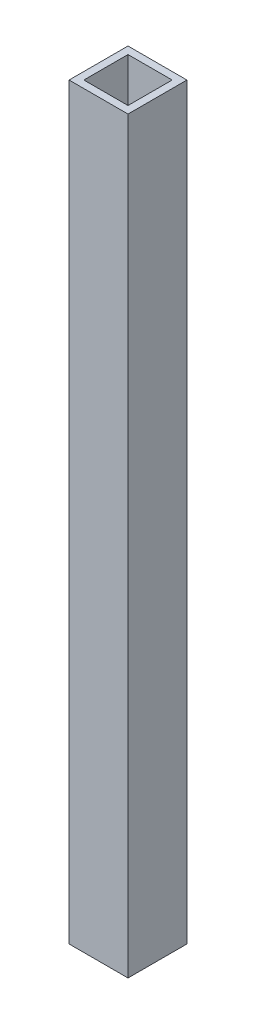
ISO-10303-21;
HEADER;
FILE_DESCRIPTION(('STEP AP214'),'2;1');
FILE_NAME('part.step','',(''),(''),'','','');
FILE_SCHEMA(('AUTOMOTIVE_DESIGN { 1 0 10303 214 1 1 1 1 }'));
ENDSEC;
DATA;
#1=APPLICATION_CONTEXT('core data for automotive mechanical design processes');
#2=APPLICATION_PROTOCOL_DEFINITION('international standard','automotive_design',2000,#1);
#3=PRODUCT_CONTEXT('',#1,'mechanical');
#4=PRODUCT('Part','Part','',(#3));
#5=PRODUCT_RELATED_PRODUCT_CATEGORY('part','',(#4));
#6=PRODUCT_DEFINITION_FORMATION('','',#4);
#7=PRODUCT_DEFINITION_CONTEXT('part definition',#1,'design');
#8=PRODUCT_DEFINITION('design','',#6,#7);
#9=PRODUCT_DEFINITION_SHAPE('','',#8);
#10=(LENGTH_UNIT() NAMED_UNIT(*) SI_UNIT(.MILLI.,.METRE.));
#11=(NAMED_UNIT(*) PLANE_ANGLE_UNIT() SI_UNIT($,.RADIAN.));
#12=(NAMED_UNIT(*) SI_UNIT($,.STERADIAN.) SOLID_ANGLE_UNIT());
#13=UNCERTAINTY_MEASURE_WITH_UNIT(LENGTH_MEASURE(1.E-05),#10,'distance_accuracy_value','');
#14=(GEOMETRIC_REPRESENTATION_CONTEXT(3) GLOBAL_UNCERTAINTY_ASSIGNED_CONTEXT((#13)) GLOBAL_UNIT_ASSIGNED_CONTEXT((#10,
#11,#12)) REPRESENTATION_CONTEXT('',''));
#15=CARTESIAN_POINT('',(0.,0.,0.));
#16=DIRECTION('',(0.,0.,1.));
#17=DIRECTION('',(1.,0.,0.));
#18=AXIS2_PLACEMENT_3D('',#15,#16,#17);
#19=CARTESIAN_POINT('',(0.,101.6,0.));
#20=DIRECTION('',(1.,0.,0.));
#21=DIRECTION('',(0.,0.,-1.));
#22=AXIS2_PLACEMENT_3D('',#19,#20,#21);
#23=PLANE('',#22);
#24=DIRECTION('',(0.,0.,1.));
#25=VECTOR('',#24,1.);
#26=CARTESIAN_POINT('',(0.,0.,0.));
#27=LINE('',#26,#25);
#28=CARTESIAN_POINT('',(0.,0.,-8.001));
#29=VERTEX_POINT('',#28);
#30=CARTESIAN_POINT('',(0.,0.,0.));
#31=VERTEX_POINT('',#30);
#32=EDGE_CURVE('E131',#29,#31,#27,.T.);
#33=ORIENTED_EDGE('',*,*,#32,.T.);
#34=DIRECTION('',(0.,-1.,0.));
#35=VECTOR('',#34,1.);
#36=CARTESIAN_POINT('',(0.,101.6,0.));
#37=LINE('',#36,#35);
#38=CARTESIAN_POINT('',(0.,101.6,0.));
#39=VERTEX_POINT('',#38);
#40=EDGE_CURVE('E11',#39,#31,#37,.T.);
#41=ORIENTED_EDGE('',*,*,#40,.F.);
#42=DIRECTION('',(0.,0.,1.));
#43=VECTOR('',#42,1.);
#44=CARTESIAN_POINT('',(0.,101.6,0.));
#45=LINE('',#44,#43);
#46=CARTESIAN_POINT('',(0.,101.6,-8.001));
#47=VERTEX_POINT('',#46);
#48=EDGE_CURVE('E135',#47,#39,#45,.T.);
#49=ORIENTED_EDGE('',*,*,#48,.F.);
#50=DIRECTION('',(0.,-1.,0.));
#51=VECTOR('',#50,1.);
#52=CARTESIAN_POINT('',(0.,101.6,-8.001));
#53=LINE('',#52,#51);
#54=EDGE_CURVE('E145',#47,#29,#53,.T.);
#55=ORIENTED_EDGE('',*,*,#54,.T.);
#56=EDGE_LOOP('',(#33,#41,#49,#55));
#57=FACE_BOUND('',#56,.T.);
#58=ADVANCED_FACE('F34',(#57),#23,.F.);
#59=CARTESIAN_POINT('',(0.,101.6,0.));
#60=DIRECTION('',(0.,0.,-1.));
#61=DIRECTION('',(-1.,0.,0.));
#62=AXIS2_PLACEMENT_3D('',#59,#60,#61);
#63=PLANE('',#62);
#64=DIRECTION('',(1.,0.,0.));
#65=VECTOR('',#64,1.);
#66=CARTESIAN_POINT('',(0.,0.,0.));
#67=LINE('',#66,#65);
#68=CARTESIAN_POINT('',(8.001,0.,0.));
#69=VERTEX_POINT('',#68);
#70=EDGE_CURVE('E148',#31,#69,#67,.T.);
#71=ORIENTED_EDGE('',*,*,#70,.T.);
#72=DIRECTION('',(0.,-1.,0.));
#73=VECTOR('',#72,1.);
#74=CARTESIAN_POINT('',(8.001,101.6,0.));
#75=LINE('',#74,#73);
#76=CARTESIAN_POINT('',(8.001,101.6,0.));
#77=VERTEX_POINT('',#76);
#78=EDGE_CURVE('E41',#77,#69,#75,.T.);
#79=ORIENTED_EDGE('',*,*,#78,.F.);
#80=DIRECTION('',(1.,0.,0.));
#81=VECTOR('',#80,1.);
#82=CARTESIAN_POINT('',(0.,101.6,0.));
#83=LINE('',#82,#81);
#84=EDGE_CURVE('E138',#39,#77,#83,.T.);
#85=ORIENTED_EDGE('',*,*,#84,.F.);
#86=ORIENTED_EDGE('',*,*,#40,.T.);
#87=EDGE_LOOP('',(#71,#79,#85,#86));
#88=FACE_BOUND('',#87,.T.);
#89=ADVANCED_FACE('F176',(#88),#63,.F.);
#90=CARTESIAN_POINT('',(8.001,101.6,0.));
#91=DIRECTION('',(-1.,0.,0.));
#92=DIRECTION('',(0.,0.,1.));
#93=AXIS2_PLACEMENT_3D('',#90,#91,#92);
#94=PLANE('',#93);
#95=DIRECTION('',(0.,0.,-1.));
#96=VECTOR('',#95,1.);
#97=CARTESIAN_POINT('',(8.001,0.,0.));
#98=LINE('',#97,#96);
#99=CARTESIAN_POINT('',(8.001,0.,-8.001));
#100=VERTEX_POINT('',#99);
#101=EDGE_CURVE('E150',#69,#100,#98,.T.);
#102=ORIENTED_EDGE('',*,*,#101,.T.);
#103=DIRECTION('',(0.,-1.,0.));
#104=VECTOR('',#103,1.);
#105=CARTESIAN_POINT('',(8.001,101.6,-8.001));
#106=LINE('',#105,#104);
#107=CARTESIAN_POINT('',(8.001,101.6,-8.001));
#108=VERTEX_POINT('',#107);
#109=EDGE_CURVE('E155',#108,#100,#106,.T.);
#110=ORIENTED_EDGE('',*,*,#109,.F.);
#111=DIRECTION('',(0.,0.,-1.));
#112=VECTOR('',#111,1.);
#113=CARTESIAN_POINT('',(8.001,101.6,0.));
#114=LINE('',#113,#112);
#115=EDGE_CURVE('E141',#77,#108,#114,.T.);
#116=ORIENTED_EDGE('',*,*,#115,.F.);
#117=ORIENTED_EDGE('',*,*,#78,.T.);
#118=EDGE_LOOP('',(#102,#110,#116,#117));
#119=FACE_BOUND('',#118,.T.);
#120=ADVANCED_FACE('F162',(#119),#94,.F.);
#121=CARTESIAN_POINT('',(0.,101.6,-8.001));
#122=DIRECTION('',(0.,0.,1.));
#123=DIRECTION('',(1.,0.,0.));
#124=AXIS2_PLACEMENT_3D('',#121,#122,#123);
#125=PLANE('',#124);
#126=DIRECTION('',(-1.,0.,0.));
#127=VECTOR('',#126,1.);
#128=CARTESIAN_POINT('',(0.,0.,-8.001));
#129=LINE('',#128,#127);
#130=EDGE_CURVE('E139',#100,#29,#129,.T.);
#131=ORIENTED_EDGE('',*,*,#130,.T.);
#132=ORIENTED_EDGE('',*,*,#54,.F.);
#133=DIRECTION('',(-1.,0.,0.));
#134=VECTOR('',#133,1.);
#135=CARTESIAN_POINT('',(0.,101.6,-8.001));
#136=LINE('',#135,#134);
#137=EDGE_CURVE('E143',#108,#47,#136,.T.);
#138=ORIENTED_EDGE('',*,*,#137,.F.);
#139=ORIENTED_EDGE('',*,*,#109,.T.);
#140=EDGE_LOOP('',(#131,#132,#138,#139));
#141=FACE_BOUND('',#140,.T.);
#142=ADVANCED_FACE('F169',(#141),#125,.F.);
#143=CARTESIAN_POINT('',(0.,101.6,0.));
#144=DIRECTION('',(0.,-1.,0.));
#145=DIRECTION('',(0.,0.,-1.));
#146=AXIS2_PLACEMENT_3D('',#143,#144,#145);
#147=PLANE('',#146);
#148=DIRECTION('',(1.,0.,0.));
#149=VECTOR('',#148,1.);
#150=CARTESIAN_POINT('',(1.0033,101.6,-1.0033));
#151=LINE('',#150,#149);
#152=CARTESIAN_POINT('',(1.0033,101.6,-1.0033));
#153=VERTEX_POINT('',#152);
#154=CARTESIAN_POINT('',(6.9977,101.6,-1.0033));
#155=VERTEX_POINT('',#154);
#156=EDGE_CURVE('E125',#153,#155,#151,.T.);
#157=ORIENTED_EDGE('',*,*,#156,.F.);
#158=DIRECTION('',(0.,0.,1.));
#159=VECTOR('',#158,1.);
#160=CARTESIAN_POINT('',(1.0033,101.6,-6.9977));
#161=LINE('',#160,#159);
#162=CARTESIAN_POINT('',(1.0033,101.6,-6.9977));
#163=VERTEX_POINT('',#162);
#164=EDGE_CURVE('E48',#163,#153,#161,.T.);
#165=ORIENTED_EDGE('',*,*,#164,.F.);
#166=DIRECTION('',(-1.,0.,0.));
#167=VECTOR('',#166,1.);
#168=CARTESIAN_POINT('',(1.0033,101.6,-6.9977));
#169=LINE('',#168,#167);
#170=CARTESIAN_POINT('',(6.9977,101.6,-6.9977));
#171=VERTEX_POINT('',#170);
#172=EDGE_CURVE('E116',#171,#163,#169,.T.);
#173=ORIENTED_EDGE('',*,*,#172,.F.);
#174=DIRECTION('',(0.,0.,-1.));
#175=VECTOR('',#174,1.);
#176=CARTESIAN_POINT('',(6.9977,101.6,-6.9977));
#177=LINE('',#176,#175);
#178=EDGE_CURVE('E119',#155,#171,#177,.T.);
#179=ORIENTED_EDGE('',*,*,#178,.F.);
#180=EDGE_LOOP('',(#157,#165,#173,#179));
#181=FACE_BOUND('',#180,.T.);
#182=ORIENTED_EDGE('',*,*,#48,.T.);
#183=ORIENTED_EDGE('',*,*,#84,.T.);
#184=ORIENTED_EDGE('',*,*,#115,.T.);
#185=ORIENTED_EDGE('',*,*,#137,.T.);
#186=EDGE_LOOP('',(#182,#183,#184,#185));
#187=FACE_BOUND('',#186,.T.);
#188=ADVANCED_FACE('F175',(#181,#187),#147,.F.);
#189=CARTESIAN_POINT('',(0.,0.,0.));
#190=DIRECTION('',(0.,-1.,0.));
#191=DIRECTION('',(0.,0.,-1.));
#192=AXIS2_PLACEMENT_3D('',#189,#190,#191);
#193=PLANE('',#192);
#194=DIRECTION('',(0.,0.,1.));
#195=VECTOR('',#194,1.);
#196=CARTESIAN_POINT('',(1.0033,0.,-6.9977));
#197=LINE('',#196,#195);
#198=CARTESIAN_POINT('',(1.0033,0.,-6.9977));
#199=VERTEX_POINT('',#198);
#200=CARTESIAN_POINT('',(1.0033,0.,-1.0033));
#201=VERTEX_POINT('',#200);
#202=EDGE_CURVE('E100',#199,#201,#197,.T.);
#203=ORIENTED_EDGE('',*,*,#202,.T.);
#204=DIRECTION('',(1.,0.,0.));
#205=VECTOR('',#204,1.);
#206=CARTESIAN_POINT('',(1.0033,0.,-1.0033));
#207=LINE('',#206,#205);
#208=CARTESIAN_POINT('',(6.9977,0.,-1.0033));
#209=VERTEX_POINT('',#208);
#210=EDGE_CURVE('E109',#201,#209,#207,.T.);
#211=ORIENTED_EDGE('',*,*,#210,.T.);
#212=DIRECTION('',(0.,0.,-1.));
#213=VECTOR('',#212,1.);
#214=CARTESIAN_POINT('',(6.9977,0.,-6.9977));
#215=LINE('',#214,#213);
#216=CARTESIAN_POINT('',(6.9977,0.,-6.9977));
#217=VERTEX_POINT('',#216);
#218=EDGE_CURVE('E56',#209,#217,#215,.T.);
#219=ORIENTED_EDGE('',*,*,#218,.T.);
#220=DIRECTION('',(-1.,0.,0.));
#221=VECTOR('',#220,1.);
#222=CARTESIAN_POINT('',(1.0033,0.,-6.9977));
#223=LINE('',#222,#221);
#224=EDGE_CURVE('E106',#217,#199,#223,.T.);
#225=ORIENTED_EDGE('',*,*,#224,.T.);
#226=EDGE_LOOP('',(#203,#211,#219,#225));
#227=FACE_BOUND('',#226,.T.);
#228=ORIENTED_EDGE('',*,*,#32,.F.);
#229=ORIENTED_EDGE('',*,*,#130,.F.);
#230=ORIENTED_EDGE('',*,*,#101,.F.);
#231=ORIENTED_EDGE('',*,*,#70,.F.);
#232=EDGE_LOOP('',(#228,#229,#230,#231));
#233=FACE_BOUND('',#232,.T.);
#234=ADVANCED_FACE('F113',(#227,#233),#193,.T.);
#235=CARTESIAN_POINT('',(1.0033,0.,-6.9977));
#236=DIRECTION('',(-1.,0.,0.));
#237=DIRECTION('',(0.,0.,1.));
#238=AXIS2_PLACEMENT_3D('',#235,#236,#237);
#239=PLANE('',#238);
#240=ORIENTED_EDGE('',*,*,#164,.T.);
#241=DIRECTION('',(0.,1.,0.));
#242=VECTOR('',#241,1.);
#243=CARTESIAN_POINT('',(1.0033,0.,-1.0033));
#244=LINE('',#243,#242);
#245=EDGE_CURVE('E96',#201,#153,#244,.T.);
#246=ORIENTED_EDGE('',*,*,#245,.F.);
#247=ORIENTED_EDGE('',*,*,#202,.F.);
#248=DIRECTION('',(0.,1.,0.));
#249=VECTOR('',#248,1.);
#250=CARTESIAN_POINT('',(1.0033,0.,-6.9977));
#251=LINE('',#250,#249);
#252=EDGE_CURVE('E129',#199,#163,#251,.T.);
#253=ORIENTED_EDGE('',*,*,#252,.T.);
#254=EDGE_LOOP('',(#240,#246,#247,#253));
#255=FACE_BOUND('',#254,.T.);
#256=ADVANCED_FACE('F98',(#255),#239,.F.);
#257=CARTESIAN_POINT('',(1.0033,0.,-6.9977));
#258=DIRECTION('',(0.,0.,-1.));
#259=DIRECTION('',(-1.,0.,0.));
#260=AXIS2_PLACEMENT_3D('',#257,#258,#259);
#261=PLANE('',#260);
#262=ORIENTED_EDGE('',*,*,#172,.T.);
#263=ORIENTED_EDGE('',*,*,#252,.F.);
#264=ORIENTED_EDGE('',*,*,#224,.F.);
#265=DIRECTION('',(0.,1.,0.));
#266=VECTOR('',#265,1.);
#267=CARTESIAN_POINT('',(6.9977,0.,-6.9977));
#268=LINE('',#267,#266);
#269=EDGE_CURVE('E132',#217,#171,#268,.T.);
#270=ORIENTED_EDGE('',*,*,#269,.T.);
#271=EDGE_LOOP('',(#262,#263,#264,#270));
#272=FACE_BOUND('',#271,.T.);
#273=ADVANCED_FACE('F193',(#272),#261,.F.);
#274=CARTESIAN_POINT('',(6.9977,0.,-6.9977));
#275=DIRECTION('',(1.,0.,0.));
#276=DIRECTION('',(0.,0.,-1.));
#277=AXIS2_PLACEMENT_3D('',#274,#275,#276);
#278=PLANE('',#277);
#279=ORIENTED_EDGE('',*,*,#178,.T.);
#280=ORIENTED_EDGE('',*,*,#269,.F.);
#281=ORIENTED_EDGE('',*,*,#218,.F.);
#282=DIRECTION('',(0.,1.,0.));
#283=VECTOR('',#282,1.);
#284=CARTESIAN_POINT('',(6.9977,0.,-1.0033));
#285=LINE('',#284,#283);
#286=EDGE_CURVE('E105',#209,#155,#285,.T.);
#287=ORIENTED_EDGE('',*,*,#286,.T.);
#288=EDGE_LOOP('',(#279,#280,#281,#287));
#289=FACE_BOUND('',#288,.T.);
#290=ADVANCED_FACE('F196',(#289),#278,.F.);
#291=CARTESIAN_POINT('',(1.0033,0.,-1.0033));
#292=DIRECTION('',(0.,0.,1.));
#293=DIRECTION('',(1.,0.,0.));
#294=AXIS2_PLACEMENT_3D('',#291,#292,#293);
#295=PLANE('',#294);
#296=ORIENTED_EDGE('',*,*,#156,.T.);
#297=ORIENTED_EDGE('',*,*,#286,.F.);
#298=ORIENTED_EDGE('',*,*,#210,.F.);
#299=ORIENTED_EDGE('',*,*,#245,.T.);
#300=EDGE_LOOP('',(#296,#297,#298,#299));
#301=FACE_BOUND('',#300,.T.);
#302=ADVANCED_FACE('F110',(#301),#295,.F.);
#303=CLOSED_SHELL('',(#58,#89,#120,#142,#188,#234,#256,#273,#290,#302));
#304=MANIFOLD_SOLID_BREP('B2',#303);
#305=ADVANCED_BREP_SHAPE_REPRESENTATION('',(#18,#304),#14);
#306=SHAPE_DEFINITION_REPRESENTATION(#9,#305);
ENDSEC;
END-ISO-10303-21;
